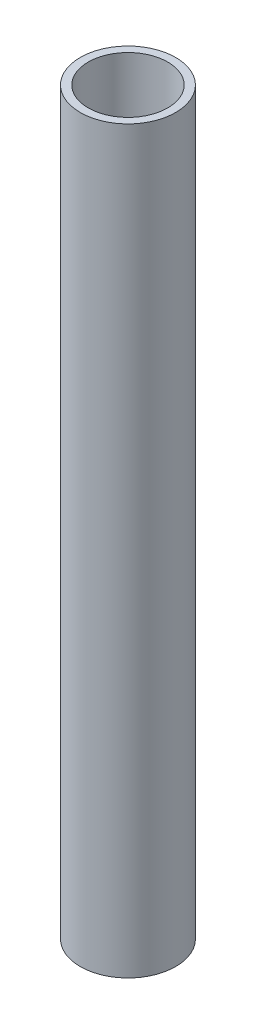
ISO-10303-21;
HEADER;
FILE_DESCRIPTION(('STEP AP214'),'2;1');
FILE_NAME('part.step','',(''),(''),'','','');
FILE_SCHEMA(('AUTOMOTIVE_DESIGN { 1 0 10303 214 1 1 1 1 }'));
ENDSEC;
DATA;
#1=APPLICATION_CONTEXT('core data for automotive mechanical design processes');
#2=APPLICATION_PROTOCOL_DEFINITION('international standard','automotive_design',2000,#1);
#3=PRODUCT_CONTEXT('',#1,'mechanical');
#4=PRODUCT('Part','Part','',(#3));
#5=PRODUCT_RELATED_PRODUCT_CATEGORY('part','',(#4));
#6=PRODUCT_DEFINITION_FORMATION('','',#4);
#7=PRODUCT_DEFINITION_CONTEXT('part definition',#1,'design');
#8=PRODUCT_DEFINITION('design','',#6,#7);
#9=PRODUCT_DEFINITION_SHAPE('','',#8);
#10=(LENGTH_UNIT() NAMED_UNIT(*) SI_UNIT(.MILLI.,.METRE.));
#11=(NAMED_UNIT(*) PLANE_ANGLE_UNIT() SI_UNIT($,.RADIAN.));
#12=(NAMED_UNIT(*) SI_UNIT($,.STERADIAN.) SOLID_ANGLE_UNIT());
#13=UNCERTAINTY_MEASURE_WITH_UNIT(LENGTH_MEASURE(1.E-05),#10,'distance_accuracy_value','');
#14=(GEOMETRIC_REPRESENTATION_CONTEXT(3) GLOBAL_UNCERTAINTY_ASSIGNED_CONTEXT((#13)) GLOBAL_UNIT_ASSIGNED_CONTEXT((#10,
#11,#12)) REPRESENTATION_CONTEXT('',''));
#15=CARTESIAN_POINT('',(0.,0.,0.));
#16=DIRECTION('',(0.,0.,1.));
#17=DIRECTION('',(1.,0.,0.));
#18=AXIS2_PLACEMENT_3D('',#15,#16,#17);
#19=CARTESIAN_POINT('',(0.,93.,0.));
#20=DIRECTION('',(0.,1.,0.));
#21=DIRECTION('',(0.,0.,1.));
#22=AXIS2_PLACEMENT_3D('',#19,#20,#21);
#23=PLANE('',#22);
#24=CARTESIAN_POINT('',(0.,93.,0.));
#25=DIRECTION('',(0.,1.,0.));
#26=DIRECTION('',(0.,0.,1.));
#27=AXIS2_PLACEMENT_3D('',#24,#25,#26);
#28=CIRCLE('',#27,6.);
#29=CARTESIAN_POINT('',(0.,93.,6.));
#30=VERTEX_POINT('',#29);
#31=EDGE_CURVE('E10',#30,#30,#28,.T.);
#32=ORIENTED_EDGE('',*,*,#31,.T.);
#33=EDGE_LOOP('',(#32));
#34=FACE_BOUND('',#33,.T.);
#35=CARTESIAN_POINT('',(0.,93.,0.));
#36=DIRECTION('',(0.,1.,0.));
#37=DIRECTION('',(0.,0.,1.));
#38=AXIS2_PLACEMENT_3D('',#35,#36,#37);
#39=CIRCLE('',#38,5.);
#40=CARTESIAN_POINT('',(0.,93.,5.));
#41=VERTEX_POINT('',#40);
#42=EDGE_CURVE('E42',#41,#41,#39,.T.);
#43=ORIENTED_EDGE('',*,*,#42,.F.);
#44=EDGE_LOOP('',(#43));
#45=FACE_BOUND('',#44,.T.);
#46=ADVANCED_FACE('F31',(#34,#45),#23,.T.);
#47=CARTESIAN_POINT('',(0.,0.,0.));
#48=DIRECTION('',(0.,1.,0.));
#49=DIRECTION('',(0.,0.,1.));
#50=AXIS2_PLACEMENT_3D('',#47,#48,#49);
#51=PLANE('',#50);
#52=CARTESIAN_POINT('',(0.,0.,0.));
#53=DIRECTION('',(0.,1.,0.));
#54=DIRECTION('',(0.,0.,1.));
#55=AXIS2_PLACEMENT_3D('',#52,#53,#54);
#56=CIRCLE('',#55,6.);
#57=CARTESIAN_POINT('',(0.,0.,6.));
#58=VERTEX_POINT('',#57);
#59=EDGE_CURVE('E35',#58,#58,#56,.T.);
#60=ORIENTED_EDGE('',*,*,#59,.F.);
#61=EDGE_LOOP('',(#60));
#62=FACE_BOUND('',#61,.T.);
#63=CARTESIAN_POINT('',(0.,0.,0.));
#64=DIRECTION('',(0.,1.,0.));
#65=DIRECTION('',(0.,0.,1.));
#66=AXIS2_PLACEMENT_3D('',#63,#64,#65);
#67=CIRCLE('',#66,5.);
#68=CARTESIAN_POINT('',(0.,0.,5.));
#69=VERTEX_POINT('',#68);
#70=EDGE_CURVE('E44',#69,#69,#67,.T.);
#71=ORIENTED_EDGE('',*,*,#70,.T.);
#72=EDGE_LOOP('',(#71));
#73=FACE_BOUND('',#72,.T.);
#74=ADVANCED_FACE('F54',(#62,#73),#51,.F.);
#75=CARTESIAN_POINT('',(0.,93.,0.));
#76=DIRECTION('',(0.,-1.,0.));
#77=DIRECTION('',(0.,0.,-1.));
#78=AXIS2_PLACEMENT_3D('',#75,#76,#77);
#79=CYLINDRICAL_SURFACE('',#78,6.);
#80=ORIENTED_EDGE('',*,*,#31,.F.);
#81=EDGE_LOOP('',(#80));
#82=FACE_BOUND('',#81,.T.);
#83=ORIENTED_EDGE('',*,*,#59,.T.);
#84=EDGE_LOOP('',(#83));
#85=FACE_BOUND('',#84,.T.);
#86=ADVANCED_FACE('F33',(#82,#85),#79,.T.);
#87=CARTESIAN_POINT('',(0.,93.,0.));
#88=DIRECTION('',(0.,-1.,0.));
#89=DIRECTION('',(0.,0.,-1.));
#90=AXIS2_PLACEMENT_3D('',#87,#88,#89);
#91=CYLINDRICAL_SURFACE('',#90,5.);
#92=ORIENTED_EDGE('',*,*,#42,.T.);
#93=EDGE_LOOP('',(#92));
#94=FACE_BOUND('',#93,.T.);
#95=ORIENTED_EDGE('',*,*,#70,.F.);
#96=EDGE_LOOP('',(#95));
#97=FACE_BOUND('',#96,.T.);
#98=ADVANCED_FACE('F50',(#94,#97),#91,.F.);
#99=CLOSED_SHELL('',(#46,#74,#86,#98));
#100=MANIFOLD_SOLID_BREP('B2',#99);
#101=ADVANCED_BREP_SHAPE_REPRESENTATION('',(#18,#100),#14);
#102=SHAPE_DEFINITION_REPRESENTATION(#9,#101);
ENDSEC;
END-ISO-10303-21;
